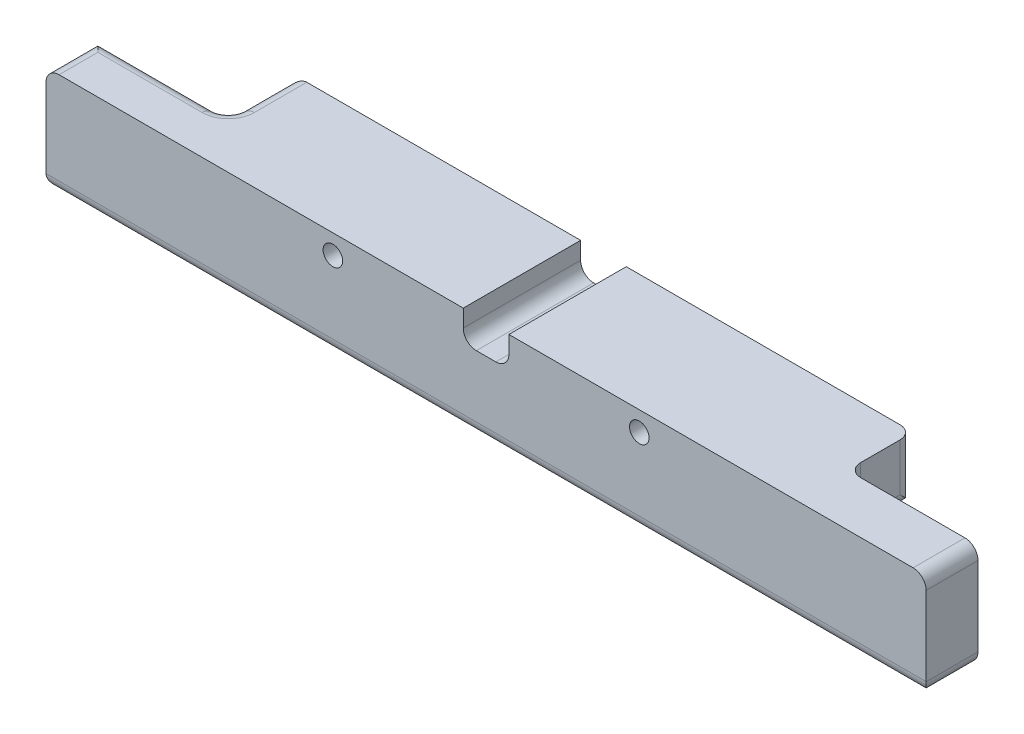
ISO-10303-21;
HEADER;
FILE_DESCRIPTION(('STEP AP214'),'2;1');
FILE_NAME('part.step','',(''),(''),'','','');
FILE_SCHEMA(('AUTOMOTIVE_DESIGN { 1 0 10303 214 1 1 1 1 }'));
ENDSEC;
DATA;
#1=APPLICATION_CONTEXT('core data for automotive mechanical design processes');
#2=APPLICATION_PROTOCOL_DEFINITION('international standard','automotive_design',2000,#1);
#3=PRODUCT_CONTEXT('',#1,'mechanical');
#4=PRODUCT('Part','Part','',(#3));
#5=PRODUCT_RELATED_PRODUCT_CATEGORY('part','',(#4));
#6=PRODUCT_DEFINITION_FORMATION('','',#4);
#7=PRODUCT_DEFINITION_CONTEXT('part definition',#1,'design');
#8=PRODUCT_DEFINITION('design','',#6,#7);
#9=PRODUCT_DEFINITION_SHAPE('','',#8);
#10=(LENGTH_UNIT() NAMED_UNIT(*) SI_UNIT(.MILLI.,.METRE.));
#11=(NAMED_UNIT(*) PLANE_ANGLE_UNIT() SI_UNIT($,.RADIAN.));
#12=(NAMED_UNIT(*) SI_UNIT($,.STERADIAN.) SOLID_ANGLE_UNIT());
#13=UNCERTAINTY_MEASURE_WITH_UNIT(LENGTH_MEASURE(1.E-05),#10,'distance_accuracy_value','');
#14=(GEOMETRIC_REPRESENTATION_CONTEXT(3) GLOBAL_UNCERTAINTY_ASSIGNED_CONTEXT((#13)) GLOBAL_UNIT_ASSIGNED_CONTEXT((#10,
#11,#12)) REPRESENTATION_CONTEXT('',''));
#15=CARTESIAN_POINT('',(0.,0.,0.));
#16=DIRECTION('',(0.,0.,1.));
#17=DIRECTION('',(1.,0.,0.));
#18=AXIS2_PLACEMENT_3D('',#15,#16,#17);
#19=CARTESIAN_POINT('',(-47.5,4.65,18.));
#20=DIRECTION('',(1.,0.,0.));
#21=DIRECTION('',(0.,0.,-1.));
#22=AXIS2_PLACEMENT_3D('',#19,#20,#21);
#23=PLANE('',#22);
#24=DIRECTION('',(0.,0.,-1.));
#25=VECTOR('',#24,1.);
#26=CARTESIAN_POINT('',(-47.5,2.65,18.));
#27=LINE('',#26,#25);
#28=CARTESIAN_POINT('',(-47.5,2.65,8.04900681792523));
#29=VERTEX_POINT('',#28);
#30=CARTESIAN_POINT('',(-47.5,2.65,2.));
#31=VERTEX_POINT('',#30);
#32=EDGE_CURVE('E279',#29,#31,#27,.T.);
#33=ORIENTED_EDGE('',*,*,#32,.T.);
#34=DIRECTION('',(0.,-1.,0.));
#35=VECTOR('',#34,1.);
#36=CARTESIAN_POINT('',(-47.5,4.65,2.));
#37=LINE('',#36,#35);
#38=CARTESIAN_POINT('',(-47.5,-4.65,2.));
#39=VERTEX_POINT('',#38);
#40=EDGE_CURVE('E283',#31,#39,#37,.T.);
#41=ORIENTED_EDGE('',*,*,#40,.T.);
#42=DIRECTION('',(0.,0.,-1.));
#43=VECTOR('',#42,1.);
#44=CARTESIAN_POINT('',(-47.5,-4.65,18.));
#45=LINE('',#44,#43);
#46=CARTESIAN_POINT('',(-47.5,-4.65,8.04900681792523));
#47=VERTEX_POINT('',#46);
#48=EDGE_CURVE('E272',#47,#39,#45,.T.);
#49=ORIENTED_EDGE('',*,*,#48,.F.);
#50=DIRECTION('',(0.,1.,0.));
#51=VECTOR('',#50,1.);
#52=CARTESIAN_POINT('',(-47.5,4.65,8.04900681792523));
#53=LINE('',#52,#51);
#54=EDGE_CURVE('E276',#47,#29,#53,.T.);
#55=ORIENTED_EDGE('',*,*,#54,.T.);
#56=EDGE_LOOP('',(#33,#41,#49,#55));
#57=FACE_BOUND('',#56,.T.);
#58=ADVANCED_FACE('F41',(#57),#23,.F.);
#59=CARTESIAN_POINT('',(-47.5,-4.65,18.));
#60=DIRECTION('',(0.,1.,0.));
#61=DIRECTION('',(-1.,0.,0.));
#62=AXIS2_PLACEMENT_3D('',#59,#60,#61);
#63=PLANE('',#62);
#64=DIRECTION('',(0.,0.,-1.));
#65=VECTOR('',#64,1.);
#66=CARTESIAN_POINT('',(45.5,-4.64999999999999,18.));
#67=LINE('',#66,#65);
#68=CARTESIAN_POINT('',(45.5,-4.64999999999999,0.));
#69=VERTEX_POINT('',#68);
#70=CARTESIAN_POINT('',(45.5,-4.64999999999999,8.04900681792523));
#71=VERTEX_POINT('',#70);
#72=EDGE_CURVE('E302',#69,#71,#67,.F.);
#73=ORIENTED_EDGE('',*,*,#72,.T.);
#74=DIRECTION('',(-1.,0.,0.));
#75=VECTOR('',#74,1.);
#76=CARTESIAN_POINT('',(-47.5,-4.65,8.04900681792523));
#77=LINE('',#76,#75);
#78=EDGE_CURVE('E305',#71,#47,#77,.T.);
#79=ORIENTED_EDGE('',*,*,#78,.T.);
#80=ORIENTED_EDGE('',*,*,#48,.T.);
#81=CARTESIAN_POINT('',(-45.5,-4.65,2.));
#82=DIRECTION('',(0.,1.,0.));
#83=DIRECTION('',(-1.,0.,0.));
#84=AXIS2_PLACEMENT_3D('',#81,#82,#83);
#85=CIRCLE('',#84,2.);
#86=CARTESIAN_POINT('',(-45.5,-4.65,0.));
#87=VERTEX_POINT('',#86);
#88=EDGE_CURVE('E299',#39,#87,#85,.F.);
#89=ORIENTED_EDGE('',*,*,#88,.T.);
#90=DIRECTION('',(1.,0.,0.));
#91=VECTOR('',#90,1.);
#92=CARTESIAN_POINT('',(-47.5,-4.65,0.));
#93=LINE('',#92,#91);
#94=EDGE_CURVE('E247',#87,#69,#93,.T.);
#95=ORIENTED_EDGE('',*,*,#94,.T.);
#96=EDGE_LOOP('',(#73,#79,#80,#89,#95));
#97=FACE_BOUND('',#96,.T.);
#98=ADVANCED_FACE('F528',(#97),#63,.F.);
#99=CARTESIAN_POINT('',(47.5,4.65000000000001,18.));
#100=DIRECTION('',(-1.,0.,0.));
#101=DIRECTION('',(0.,0.,1.));
#102=AXIS2_PLACEMENT_3D('',#99,#100,#101);
#103=PLANE('',#102);
#104=DIRECTION('',(0.,0.,-1.));
#105=VECTOR('',#104,1.);
#106=CARTESIAN_POINT('',(47.5,-2.64999999999999,18.));
#107=LINE('',#106,#105);
#108=CARTESIAN_POINT('',(47.5,-2.64999999999999,8.04900681792523));
#109=VERTEX_POINT('',#108);
#110=CARTESIAN_POINT('',(47.5,-2.64999999999999,2.));
#111=VERTEX_POINT('',#110);
#112=EDGE_CURVE('E67',#109,#111,#107,.T.);
#113=ORIENTED_EDGE('',*,*,#112,.T.);
#114=DIRECTION('',(0.,1.,0.));
#115=VECTOR('',#114,1.);
#116=CARTESIAN_POINT('',(47.5,4.65000000000001,2.));
#117=LINE('',#116,#115);
#118=CARTESIAN_POINT('',(47.5,4.65000000000001,2.));
#119=VERTEX_POINT('',#118);
#120=EDGE_CURVE('E369',#111,#119,#117,.T.);
#121=ORIENTED_EDGE('',*,*,#120,.T.);
#122=DIRECTION('',(0.,0.,-1.));
#123=VECTOR('',#122,1.);
#124=CARTESIAN_POINT('',(47.5,4.65000000000001,18.));
#125=LINE('',#124,#123);
#126=CARTESIAN_POINT('',(47.5,4.65000000000001,8.04900681792523));
#127=VERTEX_POINT('',#126);
#128=EDGE_CURVE('E226',#127,#119,#125,.T.);
#129=ORIENTED_EDGE('',*,*,#128,.F.);
#130=DIRECTION('',(0.,-1.,0.));
#131=VECTOR('',#130,1.);
#132=CARTESIAN_POINT('',(47.5,4.65,8.04900681792523));
#133=LINE('',#132,#131);
#134=EDGE_CURVE('E364',#127,#109,#133,.T.);
#135=ORIENTED_EDGE('',*,*,#134,.T.);
#136=EDGE_LOOP('',(#113,#121,#129,#135));
#137=FACE_BOUND('',#136,.T.);
#138=ADVANCED_FACE('F534',(#137),#103,.F.);
#139=CARTESIAN_POINT('',(3.5,4.65,18.));
#140=DIRECTION('',(0.,-1.,0.));
#141=DIRECTION('',(1.,0.,0.));
#142=AXIS2_PLACEMENT_3D('',#139,#140,#141);
#143=PLANE('',#142);
#144=ORIENTED_EDGE('',*,*,#128,.T.);
#145=CARTESIAN_POINT('',(45.5,4.65000000000001,2.));
#146=DIRECTION('',(0.,-1.,0.));
#147=DIRECTION('',(1.,0.,0.));
#148=AXIS2_PLACEMENT_3D('',#145,#146,#147);
#149=CIRCLE('',#148,2.);
#150=CARTESIAN_POINT('',(45.5,4.65000000000001,0.));
#151=VERTEX_POINT('',#150);
#152=EDGE_CURVE('E59',#119,#151,#149,.F.);
#153=ORIENTED_EDGE('',*,*,#152,.T.);
#154=DIRECTION('',(-1.,0.,0.));
#155=VECTOR('',#154,1.);
#156=CARTESIAN_POINT('',(3.5,4.65,0.));
#157=LINE('',#156,#155);
#158=CARTESIAN_POINT('',(3.5,4.65,0.));
#159=VERTEX_POINT('',#158);
#160=EDGE_CURVE('E221',#151,#159,#157,.T.);
#161=ORIENTED_EDGE('',*,*,#160,.T.);
#162=DIRECTION('',(0.,0.,-1.));
#163=VECTOR('',#162,1.);
#164=CARTESIAN_POINT('',(3.5,4.65,18.));
#165=LINE('',#164,#163);
#166=CARTESIAN_POINT('',(3.5,4.65,18.));
#167=VERTEX_POINT('',#166);
#168=EDGE_CURVE('E219',#167,#159,#165,.T.);
#169=ORIENTED_EDGE('',*,*,#168,.F.);
#170=DIRECTION('',(-1.,0.,0.));
#171=VECTOR('',#170,1.);
#172=CARTESIAN_POINT('',(3.5,4.65,18.));
#173=LINE('',#172,#171);
#174=CARTESIAN_POINT('',(65.5,4.65000000000001,18.));
#175=VERTEX_POINT('',#174);
#176=EDGE_CURVE('E205',#175,#167,#173,.T.);
#177=ORIENTED_EDGE('',*,*,#176,.F.);
#178=DIRECTION('',(0.,0.,1.));
#179=VECTOR('',#178,1.);
#180=CARTESIAN_POINT('',(65.5,4.65000000000001,10.0490068179252));
#181=LINE('',#180,#179);
#182=CARTESIAN_POINT('',(65.5,4.65000000000001,10.0490068179252));
#183=VERTEX_POINT('',#182);
#184=EDGE_CURVE('E372',#175,#183,#181,.F.);
#185=ORIENTED_EDGE('',*,*,#184,.T.);
#186=DIRECTION('',(-1.,0.,0.));
#187=VECTOR('',#186,1.);
#188=CARTESIAN_POINT('',(47.5,4.65000000000001,10.0490068179252));
#189=LINE('',#188,#187);
#190=CARTESIAN_POINT('',(49.5,4.65000000000001,10.0490068179252));
#191=VERTEX_POINT('',#190);
#192=EDGE_CURVE('E476',#183,#191,#189,.T.);
#193=ORIENTED_EDGE('',*,*,#192,.T.);
#194=CARTESIAN_POINT('',(49.5,4.65000000000001,8.04900681792523));
#195=DIRECTION('',(0.,-1.,0.));
#196=DIRECTION('',(1.,0.,0.));
#197=AXIS2_PLACEMENT_3D('',#194,#195,#196);
#198=CIRCLE('',#197,2.);
#199=EDGE_CURVE('E11',#191,#127,#198,.T.);
#200=ORIENTED_EDGE('',*,*,#199,.T.);
#201=EDGE_LOOP('',(#144,#153,#161,#169,#177,#185,#193,#200));
#202=FACE_BOUND('',#201,.T.);
#203=ADVANCED_FACE('F220',(#202),#143,.F.);
#204=CARTESIAN_POINT('',(3.5,0.,18.));
#205=DIRECTION('',(1.,0.,0.));
#206=DIRECTION('',(0.,1.,0.));
#207=AXIS2_PLACEMENT_3D('',#204,#205,#206);
#208=PLANE('',#207);
#209=DIRECTION('',(0.,-1.,0.));
#210=VECTOR('',#209,1.);
#211=CARTESIAN_POINT('',(3.5,0.,0.));
#212=LINE('',#211,#210);
#213=CARTESIAN_POINT('',(3.5,2.,0.));
#214=VERTEX_POINT('',#213);
#215=EDGE_CURVE('E254',#159,#214,#212,.T.);
#216=ORIENTED_EDGE('',*,*,#215,.T.);
#217=DIRECTION('',(0.,0.,-1.));
#218=VECTOR('',#217,1.);
#219=CARTESIAN_POINT('',(3.5,2.,18.));
#220=LINE('',#219,#218);
#221=CARTESIAN_POINT('',(3.5,2.,18.));
#222=VERTEX_POINT('',#221);
#223=EDGE_CURVE('E231',#214,#222,#220,.F.);
#224=ORIENTED_EDGE('',*,*,#223,.T.);
#225=DIRECTION('',(0.,-1.,0.));
#226=VECTOR('',#225,1.);
#227=CARTESIAN_POINT('',(3.5,0.,18.));
#228=LINE('',#227,#226);
#229=EDGE_CURVE('E210',#167,#222,#228,.T.);
#230=ORIENTED_EDGE('',*,*,#229,.F.);
#231=ORIENTED_EDGE('',*,*,#168,.T.);
#232=EDGE_LOOP('',(#216,#224,#230,#231));
#233=FACE_BOUND('',#232,.T.);
#234=ADVANCED_FACE('F229',(#233),#208,.F.);
#235=CARTESIAN_POINT('',(-3.5,0.,18.));
#236=DIRECTION('',(0.,-1.,0.));
#237=DIRECTION('',(1.,0.,0.));
#238=AXIS2_PLACEMENT_3D('',#235,#236,#237);
#239=PLANE('',#238);
#240=DIRECTION('',(-1.,0.,0.));
#241=VECTOR('',#240,1.);
#242=CARTESIAN_POINT('',(-3.5,0.,0.));
#243=LINE('',#242,#241);
#244=CARTESIAN_POINT('',(1.5,0.,0.));
#245=VERTEX_POINT('',#244);
#246=CARTESIAN_POINT('',(-1.5,0.,0.));
#247=VERTEX_POINT('',#246);
#248=EDGE_CURVE('E257',#245,#247,#243,.T.);
#249=ORIENTED_EDGE('',*,*,#248,.T.);
#250=DIRECTION('',(0.,0.,-1.));
#251=VECTOR('',#250,1.);
#252=CARTESIAN_POINT('',(-1.5,0.,18.));
#253=LINE('',#252,#251);
#254=CARTESIAN_POINT('',(-1.5,0.,18.));
#255=VERTEX_POINT('',#254);
#256=EDGE_CURVE('E359',#247,#255,#253,.F.);
#257=ORIENTED_EDGE('',*,*,#256,.T.);
#258=DIRECTION('',(-1.,0.,0.));
#259=VECTOR('',#258,1.);
#260=CARTESIAN_POINT('',(-3.5,0.,18.));
#261=LINE('',#260,#259);
#262=CARTESIAN_POINT('',(1.5,0.,18.));
#263=VERTEX_POINT('',#262);
#264=EDGE_CURVE('E233',#263,#255,#261,.T.);
#265=ORIENTED_EDGE('',*,*,#264,.F.);
#266=DIRECTION('',(0.,0.,-1.));
#267=VECTOR('',#266,1.);
#268=CARTESIAN_POINT('',(1.5,0.,0.));
#269=LINE('',#268,#267);
#270=EDGE_CURVE('E355',#263,#245,#269,.T.);
#271=ORIENTED_EDGE('',*,*,#270,.T.);
#272=EDGE_LOOP('',(#249,#257,#265,#271));
#273=FACE_BOUND('',#272,.T.);
#274=ADVANCED_FACE('F605',(#273),#239,.F.);
#275=CARTESIAN_POINT('',(-3.5,4.65,18.));
#276=DIRECTION('',(-1.,0.,0.));
#277=DIRECTION('',(0.,0.,1.));
#278=AXIS2_PLACEMENT_3D('',#275,#276,#277);
#279=PLANE('',#278);
#280=DIRECTION('',(0.,1.,0.));
#281=VECTOR('',#280,1.);
#282=CARTESIAN_POINT('',(-3.5,4.65,18.));
#283=LINE('',#282,#281);
#284=CARTESIAN_POINT('',(-3.5,2.,18.));
#285=VERTEX_POINT('',#284);
#286=CARTESIAN_POINT('',(-3.5,4.65,18.));
#287=VERTEX_POINT('',#286);
#288=EDGE_CURVE('E237',#285,#287,#283,.T.);
#289=ORIENTED_EDGE('',*,*,#288,.F.);
#290=DIRECTION('',(0.,0.,-1.));
#291=VECTOR('',#290,1.);
#292=CARTESIAN_POINT('',(-3.5,2.,0.));
#293=LINE('',#292,#291);
#294=CARTESIAN_POINT('',(-3.5,2.,0.));
#295=VERTEX_POINT('',#294);
#296=EDGE_CURVE('E351',#285,#295,#293,.T.);
#297=ORIENTED_EDGE('',*,*,#296,.T.);
#298=DIRECTION('',(0.,1.,0.));
#299=VECTOR('',#298,1.);
#300=CARTESIAN_POINT('',(-3.5,4.65,0.));
#301=LINE('',#300,#299);
#302=CARTESIAN_POINT('',(-3.5,4.65,0.));
#303=VERTEX_POINT('',#302);
#304=EDGE_CURVE('E261',#295,#303,#301,.T.);
#305=ORIENTED_EDGE('',*,*,#304,.T.);
#306=DIRECTION('',(0.,0.,-1.));
#307=VECTOR('',#306,1.);
#308=CARTESIAN_POINT('',(-3.5,4.65,18.));
#309=LINE('',#308,#307);
#310=EDGE_CURVE('E227',#287,#303,#309,.T.);
#311=ORIENTED_EDGE('',*,*,#310,.F.);
#312=EDGE_LOOP('',(#289,#297,#305,#311));
#313=FACE_BOUND('',#312,.T.);
#314=ADVANCED_FACE('F522',(#313),#279,.F.);
#315=CARTESIAN_POINT('',(-47.5,4.65,18.));
#316=DIRECTION('',(0.,-1.,0.));
#317=DIRECTION('',(0.,0.,-1.));
#318=AXIS2_PLACEMENT_3D('',#315,#316,#317);
#319=PLANE('',#318);
#320=DIRECTION('',(-1.,0.,0.));
#321=VECTOR('',#320,1.);
#322=CARTESIAN_POINT('',(-47.5,4.65,0.));
#323=LINE('',#322,#321);
#324=CARTESIAN_POINT('',(-45.5,4.65,0.));
#325=VERTEX_POINT('',#324);
#326=EDGE_CURVE('E216',#303,#325,#323,.T.);
#327=ORIENTED_EDGE('',*,*,#326,.T.);
#328=DIRECTION('',(0.,0.,-1.));
#329=VECTOR('',#328,1.);
#330=CARTESIAN_POINT('',(-45.5,4.65,18.));
#331=LINE('',#330,#329);
#332=CARTESIAN_POINT('',(-45.5,4.65,8.04900681792523));
#333=VERTEX_POINT('',#332);
#334=EDGE_CURVE('E296',#325,#333,#331,.F.);
#335=ORIENTED_EDGE('',*,*,#334,.T.);
#336=CARTESIAN_POINT('',(-49.5,4.65,8.04900681792523));
#337=DIRECTION('',(0.,-1.,0.));
#338=DIRECTION('',(0.,0.,-1.));
#339=AXIS2_PLACEMENT_3D('',#336,#337,#338);
#340=CIRCLE('',#339,4.);
#341=CARTESIAN_POINT('',(-49.5,4.65,12.0490068179252));
#342=VERTEX_POINT('',#341);
#343=EDGE_CURVE('E292',#342,#333,#340,.F.);
#344=ORIENTED_EDGE('',*,*,#343,.F.);
#345=DIRECTION('',(-1.,0.,0.));
#346=VECTOR('',#345,1.);
#347=CARTESIAN_POINT('',(-67.5,4.65,12.0490068179252));
#348=LINE('',#347,#346);
#349=CARTESIAN_POINT('',(-65.5,4.65,12.0490068179252));
#350=VERTEX_POINT('',#349);
#351=EDGE_CURVE('E289',#342,#350,#348,.T.);
#352=ORIENTED_EDGE('',*,*,#351,.T.);
#353=DIRECTION('',(0.,0.,1.));
#354=VECTOR('',#353,1.);
#355=CARTESIAN_POINT('',(-65.5,4.65,18.));
#356=LINE('',#355,#354);
#357=CARTESIAN_POINT('',(-65.5,4.65,18.));
#358=VERTEX_POINT('',#357);
#359=EDGE_CURVE('E286',#350,#358,#356,.T.);
#360=ORIENTED_EDGE('',*,*,#359,.T.);
#361=DIRECTION('',(-1.,0.,0.));
#362=VECTOR('',#361,1.);
#363=CARTESIAN_POINT('',(-47.5,4.65,18.));
#364=LINE('',#363,#362);
#365=EDGE_CURVE('E243',#287,#358,#364,.T.);
#366=ORIENTED_EDGE('',*,*,#365,.F.);
#367=ORIENTED_EDGE('',*,*,#310,.T.);
#368=EDGE_LOOP('',(#327,#335,#344,#352,#360,#366,#367));
#369=FACE_BOUND('',#368,.T.);
#370=ADVANCED_FACE('F513',(#369),#319,.F.);
#371=CARTESIAN_POINT('',(0.,0.,18.));
#372=DIRECTION('',(0.,0.,1.));
#373=DIRECTION('',(1.,0.,0.));
#374=AXIS2_PLACEMENT_3D('',#371,#372,#373);
#375=PLANE('',#374);
#376=CARTESIAN_POINT('',(-23.5,1.65,18.));
#377=DIRECTION('',(0.,0.,1.));
#378=DIRECTION('',(1.,0.,0.));
#379=AXIS2_PLACEMENT_3D('',#376,#377,#378);
#380=CIRCLE('',#379,1.5);
#381=CARTESIAN_POINT('',(-22.,1.65,18.));
#382=VERTEX_POINT('',#381);
#383=EDGE_CURVE('E498',#382,#382,#380,.T.);
#384=ORIENTED_EDGE('',*,*,#383,.F.);
#385=EDGE_LOOP('',(#384));
#386=FACE_BOUND('',#385,.T.);
#387=CARTESIAN_POINT('',(23.5,1.65000000000001,18.));
#388=DIRECTION('',(0.,0.,1.));
#389=DIRECTION('',(-1.,0.,0.));
#390=AXIS2_PLACEMENT_3D('',#387,#388,#389);
#391=CIRCLE('',#390,1.5);
#392=CARTESIAN_POINT('',(22.,1.65000000000001,18.));
#393=VERTEX_POINT('',#392);
#394=EDGE_CURVE('E494',#393,#393,#391,.T.);
#395=ORIENTED_EDGE('',*,*,#394,.F.);
#396=EDGE_LOOP('',(#395));
#397=FACE_BOUND('',#396,.T.);
#398=DIRECTION('',(0.,-1.,0.));
#399=VECTOR('',#398,1.);
#400=CARTESIAN_POINT('',(-67.5,4.65,18.));
#401=LINE('',#400,#399);
#402=CARTESIAN_POINT('',(-67.5,2.65,18.));
#403=VERTEX_POINT('',#402);
#404=CARTESIAN_POINT('',(-67.5,-9.48013840830418,18.));
#405=VERTEX_POINT('',#404);
#406=EDGE_CURVE('E481',#403,#405,#401,.T.);
#407=ORIENTED_EDGE('',*,*,#406,.T.);
#408=DIRECTION('',(-1.,0.,0.));
#409=VECTOR('',#408,1.);
#410=CARTESIAN_POINT('',(0.,-9.48013840830418,18.));
#411=LINE('',#410,#409);
#412=CARTESIAN_POINT('',(67.5,-9.48013840830418,18.));
#413=VERTEX_POINT('',#412);
#414=EDGE_CURVE('E348',#405,#413,#411,.F.);
#415=ORIENTED_EDGE('',*,*,#414,.T.);
#416=DIRECTION('',(0.,1.,0.));
#417=VECTOR('',#416,1.);
#418=CARTESIAN_POINT('',(67.5,4.65000000000001,18.));
#419=LINE('',#418,#417);
#420=CARTESIAN_POINT('',(67.5,2.65000000000001,18.));
#421=VERTEX_POINT('',#420);
#422=EDGE_CURVE('E445',#413,#421,#419,.T.);
#423=ORIENTED_EDGE('',*,*,#422,.T.);
#424=CARTESIAN_POINT('',(65.5,2.65000000000001,18.));
#425=DIRECTION('',(0.,0.,1.));
#426=DIRECTION('',(1.,0.,0.));
#427=AXIS2_PLACEMENT_3D('',#424,#425,#426);
#428=CIRCLE('',#427,2.);
#429=EDGE_CURVE('E213',#421,#175,#428,.T.);
#430=ORIENTED_EDGE('',*,*,#429,.T.);
#431=ORIENTED_EDGE('',*,*,#176,.T.);
#432=ORIENTED_EDGE('',*,*,#229,.T.);
#433=CARTESIAN_POINT('',(1.5,2.,18.));
#434=DIRECTION('',(0.,0.,1.));
#435=DIRECTION('',(1.,0.,0.));
#436=AXIS2_PLACEMENT_3D('',#433,#434,#435);
#437=CIRCLE('',#436,2.);
#438=EDGE_CURVE('E51',#222,#263,#437,.F.);
#439=ORIENTED_EDGE('',*,*,#438,.T.);
#440=ORIENTED_EDGE('',*,*,#264,.T.);
#441=CARTESIAN_POINT('',(-1.5,2.,18.));
#442=DIRECTION('',(0.,0.,1.));
#443=DIRECTION('',(1.,0.,0.));
#444=AXIS2_PLACEMENT_3D('',#441,#442,#443);
#445=CIRCLE('',#444,2.);
#446=EDGE_CURVE('E399',#255,#285,#445,.F.);
#447=ORIENTED_EDGE('',*,*,#446,.T.);
#448=ORIENTED_EDGE('',*,*,#288,.T.);
#449=ORIENTED_EDGE('',*,*,#365,.T.);
#450=CARTESIAN_POINT('',(-65.5,2.65,18.));
#451=DIRECTION('',(0.,0.,1.));
#452=DIRECTION('',(1.,0.,0.));
#453=AXIS2_PLACEMENT_3D('',#450,#451,#452);
#454=CIRCLE('',#453,2.);
#455=EDGE_CURVE('E343',#358,#403,#454,.T.);
#456=ORIENTED_EDGE('',*,*,#455,.T.);
#457=EDGE_LOOP('',(#407,#415,#423,#430,#431,#432,#439,#440,#447,#448,#449,#456));
#458=FACE_BOUND('',#457,.T.);
#459=ADVANCED_FACE('F208',(#386,#397,#458),#375,.T.);
#460=CARTESIAN_POINT('',(0.,0.,0.));
#461=DIRECTION('',(0.,0.,1.));
#462=DIRECTION('',(1.,0.,0.));
#463=AXIS2_PLACEMENT_3D('',#460,#461,#462);
#464=PLANE('',#463);
#465=CARTESIAN_POINT('',(-23.5,1.65,0.));
#466=DIRECTION('',(0.,0.,1.));
#467=DIRECTION('',(1.,0.,0.));
#468=AXIS2_PLACEMENT_3D('',#465,#466,#467);
#469=CIRCLE('',#468,1.5);
#470=CARTESIAN_POINT('',(-22.,1.65,0.));
#471=VERTEX_POINT('',#470);
#472=EDGE_CURVE('E251',#471,#471,#469,.T.);
#473=ORIENTED_EDGE('',*,*,#472,.T.);
#474=EDGE_LOOP('',(#473));
#475=FACE_BOUND('',#474,.T.);
#476=CARTESIAN_POINT('',(23.5,1.65000000000001,0.));
#477=DIRECTION('',(0.,0.,1.));
#478=DIRECTION('',(-1.,0.,0.));
#479=AXIS2_PLACEMENT_3D('',#476,#477,#478);
#480=CIRCLE('',#479,1.5);
#481=CARTESIAN_POINT('',(22.,1.65000000000001,0.));
#482=VERTEX_POINT('',#481);
#483=EDGE_CURVE('E502',#482,#482,#480,.T.);
#484=ORIENTED_EDGE('',*,*,#483,.T.);
#485=EDGE_LOOP('',(#484));
#486=FACE_BOUND('',#485,.T.);
#487=ORIENTED_EDGE('',*,*,#160,.F.);
#488=DIRECTION('',(0.,1.,0.));
#489=VECTOR('',#488,1.);
#490=CARTESIAN_POINT('',(45.5,0.,0.));
#491=LINE('',#490,#489);
#492=EDGE_CURVE('E380',#151,#69,#491,.F.);
#493=ORIENTED_EDGE('',*,*,#492,.T.);
#494=ORIENTED_EDGE('',*,*,#94,.F.);
#495=DIRECTION('',(0.,-1.,0.));
#496=VECTOR('',#495,1.);
#497=CARTESIAN_POINT('',(-45.5,0.,0.));
#498=LINE('',#497,#496);
#499=EDGE_CURVE('E377',#87,#325,#498,.F.);
#500=ORIENTED_EDGE('',*,*,#499,.T.);
#501=ORIENTED_EDGE('',*,*,#326,.F.);
#502=ORIENTED_EDGE('',*,*,#304,.F.);
#503=CARTESIAN_POINT('',(-1.5,2.,0.));
#504=DIRECTION('',(0.,0.,1.));
#505=DIRECTION('',(1.,0.,0.));
#506=AXIS2_PLACEMENT_3D('',#503,#504,#505);
#507=CIRCLE('',#506,2.);
#508=EDGE_CURVE('E396',#295,#247,#507,.T.);
#509=ORIENTED_EDGE('',*,*,#508,.T.);
#510=ORIENTED_EDGE('',*,*,#248,.F.);
#511=CARTESIAN_POINT('',(1.5,2.,0.));
#512=DIRECTION('',(0.,0.,1.));
#513=DIRECTION('',(1.,0.,0.));
#514=AXIS2_PLACEMENT_3D('',#511,#512,#513);
#515=CIRCLE('',#514,2.);
#516=EDGE_CURVE('E402',#245,#214,#515,.T.);
#517=ORIENTED_EDGE('',*,*,#516,.T.);
#518=ORIENTED_EDGE('',*,*,#215,.F.);
#519=EDGE_LOOP('',(#487,#493,#494,#500,#501,#502,#509,#510,#517,#518));
#520=FACE_BOUND('',#519,.T.);
#521=ADVANCED_FACE('F512',(#475,#486,#520),#464,.F.);
#522=CARTESIAN_POINT('',(23.5,1.65000000000001,0.));
#523=DIRECTION('',(0.,0.,1.));
#524=DIRECTION('',(1.,0.,0.));
#525=AXIS2_PLACEMENT_3D('',#522,#523,#524);
#526=CYLINDRICAL_SURFACE('',#525,1.5);
#527=ORIENTED_EDGE('',*,*,#483,.F.);
#528=EDGE_LOOP('',(#527));
#529=FACE_BOUND('',#528,.T.);
#530=ORIENTED_EDGE('',*,*,#394,.T.);
#531=EDGE_LOOP('',(#530));
#532=FACE_BOUND('',#531,.T.);
#533=ADVANCED_FACE('F509',(#529,#532),#526,.F.);
#534=CARTESIAN_POINT('',(-23.5,1.65,0.));
#535=DIRECTION('',(0.,0.,1.));
#536=DIRECTION('',(1.,0.,0.));
#537=AXIS2_PLACEMENT_3D('',#534,#535,#536);
#538=CYLINDRICAL_SURFACE('',#537,1.5);
#539=ORIENTED_EDGE('',*,*,#472,.F.);
#540=EDGE_LOOP('',(#539));
#541=FACE_BOUND('',#540,.T.);
#542=ORIENTED_EDGE('',*,*,#383,.T.);
#543=EDGE_LOOP('',(#542));
#544=FACE_BOUND('',#543,.T.);
#545=ADVANCED_FACE('F630',(#541,#544),#538,.F.);
#546=CARTESIAN_POINT('',(57.9818454128074,-11.4801384083042,18.));
#547=DIRECTION('',(0.,-1.,0.));
#548=DIRECTION('',(0.,0.,-1.));
#549=AXIS2_PLACEMENT_3D('',#546,#547,#548);
#550=PLANE('',#549);
#551=DIRECTION('',(-1.,0.,0.));
#552=VECTOR('',#551,1.);
#553=CARTESIAN_POINT('',(57.9818454128074,-11.4801384083042,10.0490068179252));
#554=LINE('',#553,#552);
#555=CARTESIAN_POINT('',(65.5,-11.4801384083042,10.0490068179252));
#556=VERTEX_POINT('',#555);
#557=CARTESIAN_POINT('',(-65.5,-11.4801384083042,10.0490068179252));
#558=VERTEX_POINT('',#557);
#559=EDGE_CURVE('E491',#556,#558,#554,.T.);
#560=ORIENTED_EDGE('',*,*,#559,.F.);
#561=DIRECTION('',(0.,0.,1.));
#562=VECTOR('',#561,1.);
#563=CARTESIAN_POINT('',(65.5,-11.4801384083042,18.));
#564=LINE('',#563,#562);
#565=CARTESIAN_POINT('',(65.5,-11.4801384083042,16.));
#566=VERTEX_POINT('',#565);
#567=EDGE_CURVE('E340',#556,#566,#564,.T.);
#568=ORIENTED_EDGE('',*,*,#567,.T.);
#569=DIRECTION('',(-1.,0.,0.));
#570=VECTOR('',#569,1.);
#571=CARTESIAN_POINT('',(57.9818454128074,-11.4801384083042,16.));
#572=LINE('',#571,#570);
#573=CARTESIAN_POINT('',(-65.5,-11.4801384083042,16.));
#574=VERTEX_POINT('',#573);
#575=EDGE_CURVE('E336',#566,#574,#572,.T.);
#576=ORIENTED_EDGE('',*,*,#575,.T.);
#577=DIRECTION('',(0.,0.,1.));
#578=VECTOR('',#577,1.);
#579=CARTESIAN_POINT('',(-65.5,-11.4801384083042,18.));
#580=LINE('',#579,#578);
#581=EDGE_CURVE('E333',#574,#558,#580,.F.);
#582=ORIENTED_EDGE('',*,*,#581,.T.);
#583=EDGE_LOOP('',(#560,#568,#576,#582));
#584=FACE_BOUND('',#583,.T.);
#585=ADVANCED_FACE('F628',(#584),#550,.T.);
#586=CARTESIAN_POINT('',(57.9818454128074,-4.65,10.0490068179252));
#587=DIRECTION('',(0.,0.,-1.));
#588=DIRECTION('',(0.,1.,0.));
#589=AXIS2_PLACEMENT_3D('',#586,#587,#588);
#590=PLANE('',#589);
#591=CARTESIAN_POINT('',(45.5,-2.64999999999999,10.0490068179252));
#592=DIRECTION('',(0.,0.,-1.));
#593=DIRECTION('',(0.,1.,0.));
#594=AXIS2_PLACEMENT_3D('',#591,#592,#593);
#595=CIRCLE('',#594,4.);
#596=CARTESIAN_POINT('',(49.5,-2.64999999999999,10.0490068179252));
#597=VERTEX_POINT('',#596);
#598=CARTESIAN_POINT('',(45.5,-6.64999999999999,10.0490068179252));
#599=VERTEX_POINT('',#598);
#600=EDGE_CURVE('E326',#597,#599,#595,.T.);
#601=ORIENTED_EDGE('',*,*,#600,.F.);
#602=DIRECTION('',(0.,-1.,0.));
#603=VECTOR('',#602,1.);
#604=CARTESIAN_POINT('',(49.5,-4.65,10.0490068179252));
#605=LINE('',#604,#603);
#606=EDGE_CURVE('E330',#597,#191,#605,.F.);
#607=ORIENTED_EDGE('',*,*,#606,.T.);
#608=ORIENTED_EDGE('',*,*,#192,.F.);
#609=CARTESIAN_POINT('',(65.5,2.65000000000001,10.0490068179252));
#610=DIRECTION('',(0.,0.,-1.));
#611=DIRECTION('',(0.,1.,0.));
#612=AXIS2_PLACEMENT_3D('',#609,#610,#611);
#613=CIRCLE('',#612,2.);
#614=CARTESIAN_POINT('',(67.5,2.65000000000001,10.0490068179252));
#615=VERTEX_POINT('',#614);
#616=EDGE_CURVE('E314',#183,#615,#613,.T.);
#617=ORIENTED_EDGE('',*,*,#616,.T.);
#618=DIRECTION('',(0.,1.,0.));
#619=VECTOR('',#618,1.);
#620=CARTESIAN_POINT('',(67.5,4.65000000000002,10.0490068179252));
#621=LINE('',#620,#619);
#622=CARTESIAN_POINT('',(67.5,-9.48013840830418,10.0490068179252));
#623=VERTEX_POINT('',#622);
#624=EDGE_CURVE('E467',#623,#615,#621,.T.);
#625=ORIENTED_EDGE('',*,*,#624,.F.);
#626=CARTESIAN_POINT('',(65.5,-9.48013840830418,10.0490068179252));
#627=DIRECTION('',(0.,0.,-1.));
#628=DIRECTION('',(0.,1.,0.));
#629=AXIS2_PLACEMENT_3D('',#626,#627,#628);
#630=CIRCLE('',#629,2.);
#631=EDGE_CURVE('E311',#623,#556,#630,.T.);
#632=ORIENTED_EDGE('',*,*,#631,.T.);
#633=ORIENTED_EDGE('',*,*,#559,.T.);
#634=CARTESIAN_POINT('',(-65.5,-9.48013840830418,10.0490068179252));
#635=DIRECTION('',(0.,0.,-1.));
#636=DIRECTION('',(0.,1.,0.));
#637=AXIS2_PLACEMENT_3D('',#634,#635,#636);
#638=CIRCLE('',#637,2.);
#639=CARTESIAN_POINT('',(-67.5,-9.48013840830418,10.0490068179252));
#640=VERTEX_POINT('',#639);
#641=EDGE_CURVE('E308',#558,#640,#638,.T.);
#642=ORIENTED_EDGE('',*,*,#641,.T.);
#643=DIRECTION('',(0.,-1.,0.));
#644=VECTOR('',#643,1.);
#645=CARTESIAN_POINT('',(-67.5,4.65,10.0490068179252));
#646=LINE('',#645,#644);
#647=CARTESIAN_POINT('',(-67.5,2.65,10.0490068179252));
#648=VERTEX_POINT('',#647);
#649=EDGE_CURVE('E487',#648,#640,#646,.T.);
#650=ORIENTED_EDGE('',*,*,#649,.F.);
#651=DIRECTION('',(-1.,0.,0.));
#652=VECTOR('',#651,1.);
#653=CARTESIAN_POINT('',(-47.5,2.65,10.0490068179252));
#654=LINE('',#653,#652);
#655=CARTESIAN_POINT('',(-49.5,2.65,10.0490068179252));
#656=VERTEX_POINT('',#655);
#657=EDGE_CURVE('E320',#648,#656,#654,.F.);
#658=ORIENTED_EDGE('',*,*,#657,.T.);
#659=DIRECTION('',(0.,1.,0.));
#660=VECTOR('',#659,1.);
#661=CARTESIAN_POINT('',(-49.5,-4.65,10.0490068179252));
#662=LINE('',#661,#660);
#663=CARTESIAN_POINT('',(-49.5,-6.65,10.0490068179252));
#664=VERTEX_POINT('',#663);
#665=EDGE_CURVE('E317',#656,#664,#662,.F.);
#666=ORIENTED_EDGE('',*,*,#665,.T.);
#667=DIRECTION('',(-1.,0.,0.));
#668=VECTOR('',#667,1.);
#669=CARTESIAN_POINT('',(57.9818454128074,-6.64999999999999,10.0490068179252));
#670=LINE('',#669,#668);
#671=EDGE_CURVE('E323',#664,#599,#670,.F.);
#672=ORIENTED_EDGE('',*,*,#671,.T.);
#673=EDGE_LOOP('',(#601,#607,#608,#617,#625,#632,#633,#642,#650,#658,#666,#672));
#674=FACE_BOUND('',#673,.T.);
#675=ADVANCED_FACE('F470',(#674),#590,.T.);
#676=CARTESIAN_POINT('',(-67.5,4.65,-15.6449879098521));
#677=DIRECTION('',(-1.,0.,0.));
#678=DIRECTION('',(0.,0.,1.));
#679=AXIS2_PLACEMENT_3D('',#676,#677,#678);
#680=PLANE('',#679);
#681=ORIENTED_EDGE('',*,*,#406,.F.);
#682=DIRECTION('',(0.,0.,1.));
#683=VECTOR('',#682,1.);
#684=CARTESIAN_POINT('',(-67.5,2.65,10.0490068179252));
#685=LINE('',#684,#683);
#686=EDGE_CURVE('E393',#403,#648,#685,.F.);
#687=ORIENTED_EDGE('',*,*,#686,.T.);
#688=ORIENTED_EDGE('',*,*,#649,.T.);
#689=DIRECTION('',(0.,0.,1.));
#690=VECTOR('',#689,1.);
#691=CARTESIAN_POINT('',(-67.5,-9.48013840830419,-15.6449879098521));
#692=LINE('',#691,#690);
#693=EDGE_CURVE('E390',#640,#405,#692,.T.);
#694=ORIENTED_EDGE('',*,*,#693,.T.);
#695=EDGE_LOOP('',(#681,#687,#688,#694));
#696=FACE_BOUND('',#695,.T.);
#697=ADVANCED_FACE('F623',(#696),#680,.T.);
#698=CARTESIAN_POINT('',(67.5,4.65000000000001,-15.6449879098521));
#699=DIRECTION('',(1.,0.,0.));
#700=DIRECTION('',(0.,0.,-1.));
#701=AXIS2_PLACEMENT_3D('',#698,#699,#700);
#702=PLANE('',#701);
#703=ORIENTED_EDGE('',*,*,#624,.T.);
#704=DIRECTION('',(0.,0.,1.));
#705=VECTOR('',#704,1.);
#706=CARTESIAN_POINT('',(67.5,2.65000000000001,18.));
#707=LINE('',#706,#705);
#708=EDGE_CURVE('E386',#615,#421,#707,.T.);
#709=ORIENTED_EDGE('',*,*,#708,.T.);
#710=ORIENTED_EDGE('',*,*,#422,.F.);
#711=DIRECTION('',(0.,0.,1.));
#712=VECTOR('',#711,1.);
#713=CARTESIAN_POINT('',(67.5,-9.48013840830419,-15.6449879098521));
#714=LINE('',#713,#712);
#715=EDGE_CURVE('E383',#413,#623,#714,.F.);
#716=ORIENTED_EDGE('',*,*,#715,.T.);
#717=EDGE_LOOP('',(#703,#709,#710,#716));
#718=FACE_BOUND('',#717,.T.);
#719=ADVANCED_FACE('F466',(#718),#702,.T.);
#720=CARTESIAN_POINT('',(45.5,4.65000000000001,2.));
#721=DIRECTION('',(0.,1.,0.));
#722=DIRECTION('',(0.,0.,1.));
#723=AXIS2_PLACEMENT_3D('',#720,#721,#722);
#724=CYLINDRICAL_SURFACE('',#723,2.);
#725=ORIENTED_EDGE('',*,*,#152,.F.);
#726=ORIENTED_EDGE('',*,*,#120,.F.);
#727=CARTESIAN_POINT('',(45.5,-2.64999999999999,2.));
#728=DIRECTION('',(0.,0.707106781186547,-0.707106781186547));
#729=DIRECTION('',(0.,0.707106781186547,0.707106781186547));
#730=AXIS2_PLACEMENT_3D('',#727,#728,#729);
#731=ELLIPSE('',#730,2.82842712474619,2.);
#732=EDGE_CURVE('E442',#69,#111,#731,.F.);
#733=ORIENTED_EDGE('',*,*,#732,.F.);
#734=ORIENTED_EDGE('',*,*,#492,.F.);
#735=EDGE_LOOP('',(#725,#726,#733,#734));
#736=FACE_BOUND('',#735,.T.);
#737=ADVANCED_FACE('F578',(#736),#724,.T.);
#738=CARTESIAN_POINT('',(49.5,4.65,8.04900681792523));
#739=DIRECTION('',(0.,-1.,0.));
#740=DIRECTION('',(0.,0.,-1.));
#741=AXIS2_PLACEMENT_3D('',#738,#739,#740);
#742=CYLINDRICAL_SURFACE('',#741,2.);
#743=ORIENTED_EDGE('',*,*,#199,.F.);
#744=ORIENTED_EDGE('',*,*,#606,.F.);
#745=CARTESIAN_POINT('',(49.5,-2.64999999999999,8.04900681792523));
#746=DIRECTION('',(0.,1.,0.));
#747=DIRECTION('',(0.,0.,1.));
#748=AXIS2_PLACEMENT_3D('',#745,#746,#747);
#749=CIRCLE('',#748,2.);
#750=EDGE_CURVE('E438',#109,#597,#749,.T.);
#751=ORIENTED_EDGE('',*,*,#750,.F.);
#752=ORIENTED_EDGE('',*,*,#134,.F.);
#753=EDGE_LOOP('',(#743,#744,#751,#752));
#754=FACE_BOUND('',#753,.T.);
#755=ADVANCED_FACE('F574',(#754),#742,.F.);
#756=CARTESIAN_POINT('',(45.5,-2.64999999999999,18.));
#757=DIRECTION('',(0.,0.,-1.));
#758=DIRECTION('',(-1.,0.,0.));
#759=AXIS2_PLACEMENT_3D('',#756,#757,#758);
#760=CYLINDRICAL_SURFACE('',#759,2.);
#761=ORIENTED_EDGE('',*,*,#732,.T.);
#762=ORIENTED_EDGE('',*,*,#112,.F.);
#763=CARTESIAN_POINT('',(45.5,-2.64999999999999,8.04900681792523));
#764=DIRECTION('',(0.,0.,-1.));
#765=DIRECTION('',(0.,1.,0.));
#766=AXIS2_PLACEMENT_3D('',#763,#764,#765);
#767=CIRCLE('',#766,2.);
#768=EDGE_CURVE('E434',#71,#109,#767,.F.);
#769=ORIENTED_EDGE('',*,*,#768,.F.);
#770=ORIENTED_EDGE('',*,*,#72,.F.);
#771=EDGE_LOOP('',(#761,#762,#769,#770));
#772=FACE_BOUND('',#771,.T.);
#773=ADVANCED_FACE('F570',(#772),#760,.T.);
#774=CARTESIAN_POINT('',(45.5,-2.64999999999999,8.04900681792523));
#775=DIRECTION('',(0.,0.,-1.));
#776=DIRECTION('',(0.,1.,0.));
#777=AXIS2_PLACEMENT_3D('',#774,#775,#776);
#778=TOROIDAL_SURFACE('',#777,4.,2.);
#779=ORIENTED_EDGE('',*,*,#750,.T.);
#780=ORIENTED_EDGE('',*,*,#600,.T.);
#781=CARTESIAN_POINT('',(45.5,-6.64999999999999,8.04900681792523));
#782=DIRECTION('',(-1.,0.,0.));
#783=DIRECTION('',(0.,0.,1.));
#784=AXIS2_PLACEMENT_3D('',#781,#782,#783);
#785=CIRCLE('',#784,2.);
#786=EDGE_CURVE('E430',#71,#599,#785,.F.);
#787=ORIENTED_EDGE('',*,*,#786,.F.);
#788=ORIENTED_EDGE('',*,*,#768,.T.);
#789=EDGE_LOOP('',(#779,#780,#787,#788));
#790=FACE_BOUND('',#789,.T.);
#791=ADVANCED_FACE('F566',(#790),#778,.F.);
#792=CARTESIAN_POINT('',(-65.5,2.65,18.));
#793=DIRECTION('',(0.,0.,-1.));
#794=DIRECTION('',(-1.,0.,0.));
#795=AXIS2_PLACEMENT_3D('',#792,#793,#794);
#796=CYLINDRICAL_SURFACE('',#795,2.);
#797=ORIENTED_EDGE('',*,*,#455,.F.);
#798=ORIENTED_EDGE('',*,*,#359,.F.);
#799=CARTESIAN_POINT('',(-65.5,2.65,12.0490068179252));
#800=DIRECTION('',(0.707106781186547,0.,-0.707106781186547));
#801=DIRECTION('',(-0.707106781186547,0.,-0.707106781186547));
#802=AXIS2_PLACEMENT_3D('',#799,#800,#801);
#803=ELLIPSE('',#802,2.82842712474619,2.);
#804=EDGE_CURVE('E426',#648,#350,#803,.T.);
#805=ORIENTED_EDGE('',*,*,#804,.F.);
#806=ORIENTED_EDGE('',*,*,#686,.F.);
#807=EDGE_LOOP('',(#797,#798,#805,#806));
#808=FACE_BOUND('',#807,.T.);
#809=ADVANCED_FACE('F562',(#808),#796,.T.);
#810=CARTESIAN_POINT('',(-47.5,-6.65,8.04900681792523));
#811=DIRECTION('',(-1.,0.,0.));
#812=DIRECTION('',(0.,-1.,0.));
#813=AXIS2_PLACEMENT_3D('',#810,#811,#812);
#814=CYLINDRICAL_SURFACE('',#813,2.);
#815=ORIENTED_EDGE('',*,*,#786,.T.);
#816=ORIENTED_EDGE('',*,*,#671,.F.);
#817=CARTESIAN_POINT('',(-49.5,-6.65,8.04900681792523));
#818=DIRECTION('',(-0.707106781186548,0.707106781186547,0.));
#819=DIRECTION('',(0.707106781186547,0.707106781186548,0.));
#820=AXIS2_PLACEMENT_3D('',#817,#818,#819);
#821=ELLIPSE('',#820,2.82842712474619,2.);
#822=EDGE_CURVE('E422',#47,#664,#821,.F.);
#823=ORIENTED_EDGE('',*,*,#822,.F.);
#824=ORIENTED_EDGE('',*,*,#78,.F.);
#825=EDGE_LOOP('',(#815,#816,#823,#824));
#826=FACE_BOUND('',#825,.T.);
#827=ADVANCED_FACE('F558',(#826),#814,.F.);
#828=CARTESIAN_POINT('',(-47.5,2.65,12.0490068179252));
#829=DIRECTION('',(1.,0.,0.));
#830=DIRECTION('',(0.,0.,-1.));
#831=AXIS2_PLACEMENT_3D('',#828,#829,#830);
#832=CYLINDRICAL_SURFACE('',#831,2.);
#833=ORIENTED_EDGE('',*,*,#804,.T.);
#834=ORIENTED_EDGE('',*,*,#351,.F.);
#835=CARTESIAN_POINT('',(-49.5,2.65,12.0490068179252));
#836=DIRECTION('',(1.,0.,0.));
#837=DIRECTION('',(0.,0.,-1.));
#838=AXIS2_PLACEMENT_3D('',#835,#836,#837);
#839=CIRCLE('',#838,2.);
#840=EDGE_CURVE('E418',#656,#342,#839,.T.);
#841=ORIENTED_EDGE('',*,*,#840,.F.);
#842=ORIENTED_EDGE('',*,*,#657,.F.);
#843=EDGE_LOOP('',(#833,#834,#841,#842));
#844=FACE_BOUND('',#843,.T.);
#845=ADVANCED_FACE('F554',(#844),#832,.T.);
#846=CARTESIAN_POINT('',(-49.5,4.65,8.04900681792523));
#847=DIRECTION('',(0.,1.,0.));
#848=DIRECTION('',(0.,0.,1.));
#849=AXIS2_PLACEMENT_3D('',#846,#847,#848);
#850=CYLINDRICAL_SURFACE('',#849,2.);
#851=ORIENTED_EDGE('',*,*,#822,.T.);
#852=ORIENTED_EDGE('',*,*,#665,.F.);
#853=CARTESIAN_POINT('',(-49.5,2.65,8.04900681792523));
#854=DIRECTION('',(0.,-1.,0.));
#855=DIRECTION('',(0.,0.,-1.));
#856=AXIS2_PLACEMENT_3D('',#853,#854,#855);
#857=CIRCLE('',#856,2.);
#858=EDGE_CURVE('E414',#29,#656,#857,.T.);
#859=ORIENTED_EDGE('',*,*,#858,.F.);
#860=ORIENTED_EDGE('',*,*,#54,.F.);
#861=EDGE_LOOP('',(#851,#852,#859,#860));
#862=FACE_BOUND('',#861,.T.);
#863=ADVANCED_FACE('F550',(#862),#850,.F.);
#864=CARTESIAN_POINT('',(-49.5,2.65,8.04900681792523));
#865=DIRECTION('',(0.,-1.,0.));
#866=DIRECTION('',(0.,0.,-1.));
#867=AXIS2_PLACEMENT_3D('',#864,#865,#866);
#868=TOROIDAL_SURFACE('',#867,4.,2.);
#869=ORIENTED_EDGE('',*,*,#840,.T.);
#870=ORIENTED_EDGE('',*,*,#343,.T.);
#871=CARTESIAN_POINT('',(-45.5,2.65,8.04900681792523));
#872=DIRECTION('',(0.,0.,1.));
#873=DIRECTION('',(1.,0.,0.));
#874=AXIS2_PLACEMENT_3D('',#871,#872,#873);
#875=CIRCLE('',#874,2.);
#876=EDGE_CURVE('E410',#29,#333,#875,.F.);
#877=ORIENTED_EDGE('',*,*,#876,.F.);
#878=ORIENTED_EDGE('',*,*,#858,.T.);
#879=EDGE_LOOP('',(#869,#870,#877,#878));
#880=FACE_BOUND('',#879,.T.);
#881=ADVANCED_FACE('F546',(#880),#868,.T.);
#882=CARTESIAN_POINT('',(-45.5,4.65,2.));
#883=DIRECTION('',(0.,-1.,0.));
#884=DIRECTION('',(0.,0.,-1.));
#885=AXIS2_PLACEMENT_3D('',#882,#883,#884);
#886=CYLINDRICAL_SURFACE('',#885,2.);
#887=ORIENTED_EDGE('',*,*,#88,.F.);
#888=ORIENTED_EDGE('',*,*,#40,.F.);
#889=CARTESIAN_POINT('',(-45.5,2.65,2.));
#890=DIRECTION('',(0.,-0.707106781186547,-0.707106781186547));
#891=DIRECTION('',(0.,-0.707106781186547,0.707106781186547));
#892=AXIS2_PLACEMENT_3D('',#889,#890,#891);
#893=ELLIPSE('',#892,2.82842712474619,2.);
#894=EDGE_CURVE('E407',#325,#31,#893,.F.);
#895=ORIENTED_EDGE('',*,*,#894,.F.);
#896=ORIENTED_EDGE('',*,*,#499,.F.);
#897=EDGE_LOOP('',(#887,#888,#895,#896));
#898=FACE_BOUND('',#897,.T.);
#899=ADVANCED_FACE('F542',(#898),#886,.T.);
#900=CARTESIAN_POINT('',(-45.5,2.65,18.));
#901=DIRECTION('',(0.,0.,-1.));
#902=DIRECTION('',(-1.,0.,0.));
#903=AXIS2_PLACEMENT_3D('',#900,#901,#902);
#904=CYLINDRICAL_SURFACE('',#903,2.);
#905=ORIENTED_EDGE('',*,*,#876,.T.);
#906=ORIENTED_EDGE('',*,*,#334,.F.);
#907=ORIENTED_EDGE('',*,*,#894,.T.);
#908=ORIENTED_EDGE('',*,*,#32,.F.);
#909=EDGE_LOOP('',(#905,#906,#907,#908));
#910=FACE_BOUND('',#909,.T.);
#911=ADVANCED_FACE('F539',(#910),#904,.T.);
#912=CARTESIAN_POINT('',(65.5,-9.48013840830418,18.));
#913=DIRECTION('',(0.,0.,1.));
#914=DIRECTION('',(0.,-1.,0.));
#915=AXIS2_PLACEMENT_3D('',#912,#913,#914);
#916=CYLINDRICAL_SURFACE('',#915,2.);
#917=ORIENTED_EDGE('',*,*,#631,.F.);
#918=ORIENTED_EDGE('',*,*,#715,.F.);
#919=CARTESIAN_POINT('',(65.5,-9.48013840830418,16.));
#920=DIRECTION('',(-0.707106781186547,0.,0.707106781186547));
#921=DIRECTION('',(0.707106781186547,0.,0.707106781186547));
#922=AXIS2_PLACEMENT_3D('',#919,#920,#921);
#923=ELLIPSE('',#922,2.82842712474619,2.);
#924=EDGE_CURVE('E45',#566,#413,#923,.T.);
#925=ORIENTED_EDGE('',*,*,#924,.F.);
#926=ORIENTED_EDGE('',*,*,#567,.F.);
#927=EDGE_LOOP('',(#917,#918,#925,#926));
#928=FACE_BOUND('',#927,.T.);
#929=ADVANCED_FACE('F461',(#928),#916,.T.);
#930=CARTESIAN_POINT('',(-65.5,-9.48013840830419,-15.6449879098521));
#931=DIRECTION('',(0.,0.,1.));
#932=DIRECTION('',(0.,-1.,0.));
#933=AXIS2_PLACEMENT_3D('',#930,#931,#932);
#934=CYLINDRICAL_SURFACE('',#933,2.);
#935=ORIENTED_EDGE('',*,*,#641,.F.);
#936=ORIENTED_EDGE('',*,*,#581,.F.);
#937=CARTESIAN_POINT('',(-65.5,-9.48013840830418,16.));
#938=DIRECTION('',(0.707106781186547,0.,0.707106781186547));
#939=DIRECTION('',(-0.707106781186547,0.,0.707106781186547));
#940=AXIS2_PLACEMENT_3D('',#937,#938,#939);
#941=ELLIPSE('',#940,2.82842712474619,2.);
#942=EDGE_CURVE('E446',#405,#574,#941,.T.);
#943=ORIENTED_EDGE('',*,*,#942,.F.);
#944=ORIENTED_EDGE('',*,*,#693,.F.);
#945=EDGE_LOOP('',(#935,#936,#943,#944));
#946=FACE_BOUND('',#945,.T.);
#947=ADVANCED_FACE('F586',(#946),#934,.T.);
#948=CARTESIAN_POINT('',(57.9818454128074,-9.48013840830418,16.));
#949=DIRECTION('',(-1.,0.,0.));
#950=DIRECTION('',(0.,0.,1.));
#951=AXIS2_PLACEMENT_3D('',#948,#949,#950);
#952=CYLINDRICAL_SURFACE('',#951,2.);
#953=ORIENTED_EDGE('',*,*,#924,.T.);
#954=ORIENTED_EDGE('',*,*,#414,.F.);
#955=ORIENTED_EDGE('',*,*,#942,.T.);
#956=ORIENTED_EDGE('',*,*,#575,.F.);
#957=EDGE_LOOP('',(#953,#954,#955,#956));
#958=FACE_BOUND('',#957,.T.);
#959=ADVANCED_FACE('F456',(#958),#952,.T.);
#960=CARTESIAN_POINT('',(-1.5,2.,18.));
#961=DIRECTION('',(0.,0.,1.));
#962=DIRECTION('',(1.,0.,0.));
#963=AXIS2_PLACEMENT_3D('',#960,#961,#962);
#964=CYLINDRICAL_SURFACE('',#963,2.);
#965=ORIENTED_EDGE('',*,*,#446,.F.);
#966=ORIENTED_EDGE('',*,*,#256,.F.);
#967=ORIENTED_EDGE('',*,*,#508,.F.);
#968=ORIENTED_EDGE('',*,*,#296,.F.);
#969=EDGE_LOOP('',(#965,#966,#967,#968));
#970=FACE_BOUND('',#969,.T.);
#971=ADVANCED_FACE('F585',(#970),#964,.F.);
#972=CARTESIAN_POINT('',(1.5,2.,18.));
#973=DIRECTION('',(0.,0.,1.));
#974=DIRECTION('',(1.,0.,0.));
#975=AXIS2_PLACEMENT_3D('',#972,#973,#974);
#976=CYLINDRICAL_SURFACE('',#975,2.);
#977=ORIENTED_EDGE('',*,*,#438,.F.);
#978=ORIENTED_EDGE('',*,*,#223,.F.);
#979=ORIENTED_EDGE('',*,*,#516,.F.);
#980=ORIENTED_EDGE('',*,*,#270,.F.);
#981=EDGE_LOOP('',(#977,#978,#979,#980));
#982=FACE_BOUND('',#981,.T.);
#983=ADVANCED_FACE('F593',(#982),#976,.F.);
#984=CARTESIAN_POINT('',(65.5,2.65000000000001,-15.6449879098521));
#985=DIRECTION('',(0.,0.,-1.));
#986=DIRECTION('',(-1.,0.,0.));
#987=AXIS2_PLACEMENT_3D('',#984,#985,#986);
#988=CYLINDRICAL_SURFACE('',#987,2.);
#989=ORIENTED_EDGE('',*,*,#616,.F.);
#990=ORIENTED_EDGE('',*,*,#184,.F.);
#991=ORIENTED_EDGE('',*,*,#429,.F.);
#992=ORIENTED_EDGE('',*,*,#708,.F.);
#993=EDGE_LOOP('',(#989,#990,#991,#992));
#994=FACE_BOUND('',#993,.T.);
#995=ADVANCED_FACE('F43',(#994),#988,.T.);
#996=CLOSED_SHELL('',(#58,#98,#138,#203,#234,#274,#314,#370,#459,#521,#533,#545,#585,#675,#697,
#719,#737,#755,#773,#791,#809,#827,#845,#863,#881,#899,#911,#929,#947,#959,#971,#983,#995));
#997=MANIFOLD_SOLID_BREP('B2',#996);
#998=ADVANCED_BREP_SHAPE_REPRESENTATION('',(#18,#997),#14);
#999=SHAPE_DEFINITION_REPRESENTATION(#9,#998);
ENDSEC;
END-ISO-10303-21;
